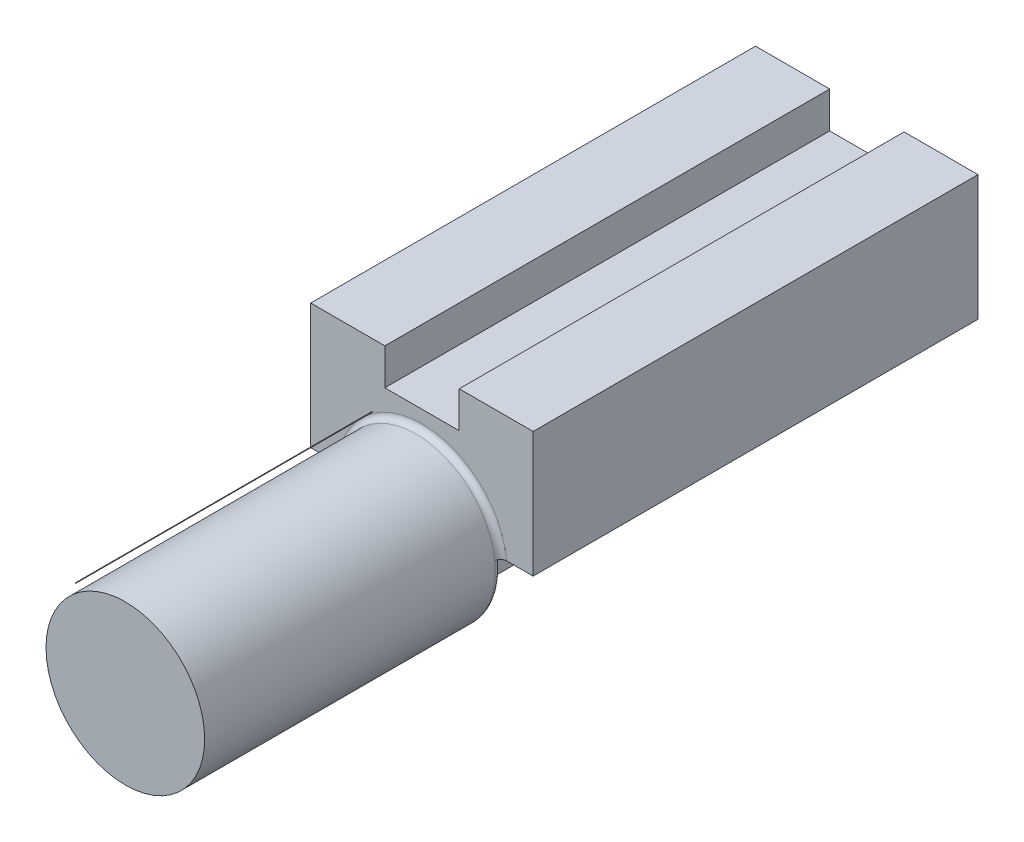
ISO-10303-21;
HEADER;
FILE_DESCRIPTION(('STEP AP214'),'2;1');
FILE_NAME('part.step','',(''),(''),'','','');
FILE_SCHEMA(('AUTOMOTIVE_DESIGN { 1 0 10303 214 1 1 1 1 }'));
ENDSEC;
DATA;
#1=APPLICATION_CONTEXT('core data for automotive mechanical design processes');
#2=APPLICATION_PROTOCOL_DEFINITION('international standard','automotive_design',2000,#1);
#3=PRODUCT_CONTEXT('',#1,'mechanical');
#4=PRODUCT('Part','Part','',(#3));
#5=PRODUCT_RELATED_PRODUCT_CATEGORY('part','',(#4));
#6=PRODUCT_DEFINITION_FORMATION('','',#4);
#7=PRODUCT_DEFINITION_CONTEXT('part definition',#1,'design');
#8=PRODUCT_DEFINITION('design','',#6,#7);
#9=PRODUCT_DEFINITION_SHAPE('','',#8);
#10=(LENGTH_UNIT() NAMED_UNIT(*) SI_UNIT(.MILLI.,.METRE.));
#11=(NAMED_UNIT(*) PLANE_ANGLE_UNIT() SI_UNIT($,.RADIAN.));
#12=(NAMED_UNIT(*) SI_UNIT($,.STERADIAN.) SOLID_ANGLE_UNIT());
#13=UNCERTAINTY_MEASURE_WITH_UNIT(LENGTH_MEASURE(1.E-05),#10,'distance_accuracy_value','');
#14=(GEOMETRIC_REPRESENTATION_CONTEXT(3) GLOBAL_UNCERTAINTY_ASSIGNED_CONTEXT((#13)) GLOBAL_UNIT_ASSIGNED_CONTEXT((#10,
#11,#12)) REPRESENTATION_CONTEXT('',''));
#15=CARTESIAN_POINT('',(0.,0.,0.));
#16=DIRECTION('',(0.,0.,1.));
#17=DIRECTION('',(1.,0.,0.));
#18=AXIS2_PLACEMENT_3D('',#15,#16,#17);
#19=CARTESIAN_POINT('',(-47.3964000000001,-5.63879999999999,76.2));
#20=DIRECTION('',(0.,1.,0.));
#21=DIRECTION('',(0.,0.,1.));
#22=AXIS2_PLACEMENT_3D('',#19,#20,#21);
#23=PLANE('',#22);
#24=DIRECTION('',(0.,0.,1.));
#25=VECTOR('',#24,1.);
#26=CARTESIAN_POINT('',(-15.6464000000001,-5.63879999999999,38.1));
#27=LINE('',#26,#25);
#28=CARTESIAN_POINT('',(-15.6464000000001,-5.63879999999999,38.1));
#29=VERTEX_POINT('',#28);
#30=CARTESIAN_POINT('',(-15.6464000000001,-5.63879999999999,76.2236882308211));
#31=VERTEX_POINT('',#30);
#32=EDGE_CURVE('E4018',#29,#31,#27,.T.);
#33=ORIENTED_EDGE('',*,*,#32,.F.);
#34=DIRECTION('',(-1.,0.,0.));
#35=VECTOR('',#34,1.);
#36=CARTESIAN_POINT('',(-41.0464000000001,-5.63879999999999,38.1));
#37=LINE('',#36,#35);
#38=CARTESIAN_POINT('',(-41.0464000000001,-5.63879999999999,38.1));
#39=VERTEX_POINT('',#38);
#40=EDGE_CURVE('E3990',#29,#39,#37,.T.);
#41=ORIENTED_EDGE('',*,*,#40,.T.);
#42=DIRECTION('',(0.,0.,1.));
#43=VECTOR('',#42,1.);
#44=CARTESIAN_POINT('',(-41.0464000000001,-5.63879999999999,38.1));
#45=LINE('',#44,#43);
#46=CARTESIAN_POINT('',(-41.0464000000001,-5.63879999999999,76.2236882308211));
#47=VERTEX_POINT('',#46);
#48=EDGE_CURVE('E4003',#39,#47,#45,.T.);
#49=ORIENTED_EDGE('',*,*,#48,.T.);
#50=CARTESIAN_POINT('',(-41.0464000000001,-5.63879999999999,76.2236882308211));
#51=CARTESIAN_POINT('',(-41.0745673618872,-5.63879999999999,76.2298356875055));
#52=CARTESIAN_POINT('',(-41.1024631568323,-5.63879999999999,76.2371637991376));
#53=CARTESIAN_POINT('',(-41.1575409224726,-5.63879999999999,76.2541346686096));
#54=CARTESIAN_POINT('',(-41.1847229059231,-5.63879999999999,76.2637773850578));
#55=CARTESIAN_POINT('',(-41.2648883701838,-5.63879999999999,76.2960855787988));
#56=CARTESIAN_POINT('',(-41.3165502569435,-5.63879999999999,76.3221439975724));
#57=CARTESIAN_POINT('',(-41.4147603234984,-5.63879999999999,76.3825795643533));
#58=CARTESIAN_POINT('',(-41.4613056567482,-5.63879999999999,76.416961309245));
#59=CARTESIAN_POINT('',(-41.5479144792402,-5.63879999999999,76.4930719555936));
#60=CARTESIAN_POINT('',(-41.5879811123641,-5.63879999999999,76.534797272823));
#61=CARTESIAN_POINT('',(-41.6603071549674,-5.63879999999999,76.6242219813312));
#62=CARTESIAN_POINT('',(-41.6926016566485,-5.63879999999999,76.6718929860687));
#63=CARTESIAN_POINT('',(-41.7486835857908,-5.63879999999999,76.7720179124678));
#64=CARTESIAN_POINT('',(-41.7724679112481,-5.63879999999999,76.824473569435));
#65=CARTESIAN_POINT('',(-41.8107834457671,-5.63879999999999,76.9326180229628));
#66=CARTESIAN_POINT('',(-41.8253264104508,-5.63879999999999,76.9883026132558));
#67=CARTESIAN_POINT('',(-41.8399110922225,-5.63879999999999,77.0730314747033));
#68=CARTESIAN_POINT('',(-41.8435677151144,-5.63879999999999,77.101496611216));
#69=CARTESIAN_POINT('',(-41.8484480151739,-5.63879999999999,77.1586364860304));
#70=CARTESIAN_POINT('',(-41.8496715420849,-5.63879999999999,77.1873112371672));
#71=CARTESIAN_POINT('',(-41.8496716406063,-5.63879999999999,77.216));
#72=B_SPLINE_CURVE_WITH_KNOTS('',3,(#50,#51,#52,#53,#54,#55,#56,#57,#58,#59,#60,#61,#62,#63,#64,
#65,#66,#67,#68,#69,#70,#71),.UNSPECIFIED.,.F.,.F.,(4,2,2,2,2,2,2,2,2,2,4),(0.,
0.0864385978041805,0.172875649960301,0.345571181396731,0.51836230920786,0.691069334376681,
0.862981285382449,1.03495583551407,1.20671118239226,1.2927182741941,1.37873067723016),.UNSPECIFIED.);
#73=CARTESIAN_POINT('',(-41.8496716406063,-5.63879999999999,77.216));
#74=VERTEX_POINT('',#73);
#75=EDGE_CURVE('E4169',#47,#74,#72,.T.);
#76=ORIENTED_EDGE('',*,*,#75,.T.);
#77=CARTESIAN_POINT('',(-41.8496716406063,-5.63879999999999,77.216));
#78=CARTESIAN_POINT('',(-41.8496717272595,-5.63879999999999,77.1875432249238));
#79=CARTESIAN_POINT('',(-41.8508755472698,-5.63879999999999,77.1591001317297));
#80=CARTESIAN_POINT('',(-41.8556773797049,-5.63879999999999,77.1024185494894));
#81=CARTESIAN_POINT('',(-41.8592752451009,-5.63879999999999,77.0741800479859));
#82=CARTESIAN_POINT('',(-41.8736226655196,-5.63879999999999,76.9901348543328));
#83=CARTESIAN_POINT('',(-41.8879261578878,-5.63879999999999,76.9348928500431));
#84=CARTESIAN_POINT('',(-41.9255979647431,-5.63879999999999,76.8275985463471));
#85=CARTESIAN_POINT('',(-41.9489700343889,-5.63879999999999,76.7755475786531));
#86=CARTESIAN_POINT('',(-42.0040946591598,-5.63879999999999,76.6760920453542));
#87=CARTESIAN_POINT('',(-42.0358461903603,-5.63879999999999,76.6286869130233));
#88=CARTESIAN_POINT('',(-42.1069161567733,-5.63879999999999,76.5397144218545));
#89=CARTESIAN_POINT('',(-42.1462562065649,-5.63879999999999,76.4981643395665));
#90=CARTESIAN_POINT('',(-42.2313259529208,-5.63879999999999,76.4222028577843));
#91=CARTESIAN_POINT('',(-42.2770569830643,-5.63879999999999,76.3877929519341));
#92=CARTESIAN_POINT('',(-42.3738954269246,-5.63879999999999,76.3268801707643));
#93=CARTESIAN_POINT('',(-42.4250337470711,-5.63879999999999,76.3004264842558));
#94=CARTESIAN_POINT('',(-42.5310015256305,-5.63879999999999,76.2564435308777));
#95=CARTESIAN_POINT('',(-42.5858290821921,-5.63879999999999,76.2389097050081));
#96=CARTESIAN_POINT('',(-42.6794103650222,-5.63879999999999,76.2174090948916));
#97=CARTESIAN_POINT('',(-42.7175966049423,-5.63879999999999,76.2108849969276));
#98=CARTESIAN_POINT('',(-42.7944065396167,-5.63879999999999,76.2021808252532));
#99=CARTESIAN_POINT('',(-42.833029544704,-5.63879999999999,76.1999946637489));
#100=CARTESIAN_POINT('',(-42.8716693262466,-5.63879999999999,76.2));
#101=B_SPLINE_CURVE_WITH_KNOTS('',3,(#77,#78,#79,#80,#81,#82,#83,#84,#85,#86,#87,#88,#89,#90,
#91,#92,#93,#94,#95,#96,#97,#98,#99,#100),.UNSPECIFIED.,.F.,.F.,(4,2,2,2,2,2,2,2,2,2,2,4),(0.,
0.0853177217724107,0.170630204297843,0.340942346005494,0.511325086749412,0.681687017279454,
0.852541557256624,1.02343180211681,1.19535781740002,1.36719587164696,1.48318374305112,
1.599008723395),.UNSPECIFIED.);
#102=CARTESIAN_POINT('',(-42.8716693262466,-5.63879999999999,76.2));
#103=VERTEX_POINT('',#102);
#104=EDGE_CURVE('E3878',#74,#103,#101,.T.);
#105=ORIENTED_EDGE('',*,*,#104,.T.);
#106=DIRECTION('',(1.,0.,0.));
#107=VECTOR('',#106,1.);
#108=CARTESIAN_POINT('',(-47.3964000000001,-5.63879999999999,76.2));
#109=LINE('',#108,#107);
#110=CARTESIAN_POINT('',(-47.3964000000001,-5.63879999999999,76.2));
#111=VERTEX_POINT('',#110);
#112=EDGE_CURVE('E4037',#111,#103,#109,.T.);
#113=ORIENTED_EDGE('',*,*,#112,.F.);
#114=DIRECTION('',(0.,0.,-1.));
#115=VECTOR('',#114,1.);
#116=CARTESIAN_POINT('',(-47.3964000000001,-5.63879999999999,76.2));
#117=LINE('',#116,#115);
#118=CARTESIAN_POINT('',(-47.3964000000001,-5.63879999999999,0.));
#119=VERTEX_POINT('',#118);
#120=EDGE_CURVE('E4035',#111,#119,#117,.T.);
#121=ORIENTED_EDGE('',*,*,#120,.T.);
#122=DIRECTION('',(1.,0.,0.));
#123=VECTOR('',#122,1.);
#124=CARTESIAN_POINT('',(-47.3964000000001,-5.63879999999999,0.));
#125=LINE('',#124,#123);
#126=CARTESIAN_POINT('',(-9.29640000000005,-5.63879999999999,0.));
#127=VERTEX_POINT('',#126);
#128=EDGE_CURVE('E4030',#119,#127,#125,.T.);
#129=ORIENTED_EDGE('',*,*,#128,.T.);
#130=DIRECTION('',(0.,0.,-1.));
#131=VECTOR('',#130,1.);
#132=CARTESIAN_POINT('',(-9.29640000000005,-5.63879999999999,76.2));
#133=LINE('',#132,#131);
#134=CARTESIAN_POINT('',(-9.29640000000005,-5.63879999999999,76.2));
#135=VERTEX_POINT('',#134);
#136=EDGE_CURVE('E4109',#135,#127,#133,.T.);
#137=ORIENTED_EDGE('',*,*,#136,.F.);
#138=CARTESIAN_POINT('',(-13.8211306737535,-5.63879999999999,76.2));
#139=VERTEX_POINT('',#138);
#140=EDGE_CURVE('E4036',#139,#135,#109,.T.);
#141=ORIENTED_EDGE('',*,*,#140,.F.);
#142=CARTESIAN_POINT('',(-13.8211306737535,-5.63879999999999,76.2));
#143=CARTESIAN_POINT('',(-13.8500026760034,-5.63879999999999,76.2000002739252));
#144=CARTESIAN_POINT('',(-13.8788608477045,-5.63879999999999,76.20121805118));
#145=CARTESIAN_POINT('',(-13.936371317331,-5.63879999999999,76.2060763412908));
#146=CARTESIAN_POINT('',(-13.9650236235252,-5.63879999999999,76.2097167562842));
#147=CARTESIAN_POINT('',(-14.0503222330379,-5.63879999999999,76.2242391068142));
#148=CARTESIAN_POINT('',(-14.1063982458794,-5.63879999999999,76.2387222332714));
#149=CARTESIAN_POINT('',(-14.2153231222594,-5.63879999999999,76.2768999441325));
#150=CARTESIAN_POINT('',(-14.2681702988293,-5.63879999999999,76.30059929691));
#151=CARTESIAN_POINT('',(-14.3691214099318,-5.63879999999999,76.3565494148125));
#152=CARTESIAN_POINT('',(-14.4172263505665,-5.63879999999999,76.3887983606958));
#153=CARTESIAN_POINT('',(-14.5072081289998,-5.63879999999999,76.4608700138062));
#154=CARTESIAN_POINT('',(-14.5490982507614,-5.63879999999999,76.5006761398794));
#155=CARTESIAN_POINT('',(-14.625565650567,-5.63879999999999,76.5868006668113));
#156=CARTESIAN_POINT('',(-14.6601415950229,-5.63879999999999,76.6331202527053));
#157=CARTESIAN_POINT('',(-14.720787707501,-5.63879999999999,76.7306831123724));
#158=CARTESIAN_POINT('',(-14.7469017511652,-5.63879999999999,76.7818991449183));
#159=CARTESIAN_POINT('',(-14.7900896967655,-5.63879999999999,76.8879941889962));
#160=CARTESIAN_POINT('',(-14.8071696967977,-5.63879999999999,76.9428707014085));
#161=CARTESIAN_POINT('',(-14.8273412335828,-5.63879999999999,77.0344299801769));
#162=CARTESIAN_POINT('',(-14.8332578064347,-5.63879999999999,77.0705149932606));
#163=CARTESIAN_POINT('',(-14.8411507001682,-5.63879999999999,77.1430613805037));
#164=CARTESIAN_POINT('',(-14.8431326073051,-5.63879999999999,77.179522147099));
#165=CARTESIAN_POINT('',(-14.8431283593938,-5.63879999999999,77.216));
#166=B_SPLINE_CURVE_WITH_KNOTS('',3,(#142,#143,#144,#145,#146,#147,#148,#149,#150,#151,#152,
#153,#154,#155,#156,#157,#158,#159,#160,#161,#162,#163,#164,#165),.UNSPECIFIED.,.F.,.F.,(4,2,2,
2,2,2,2,2,2,2,2,4),(0.,0.0865628602947868,0.173122224091188,0.345980249859958,0.518927829702763,
0.691838638054347,0.864374359185328,1.03694151155104,1.2085990130016,1.38014049506961,
1.48964254135696,1.59898901024009),.UNSPECIFIED.);
#167=CARTESIAN_POINT('',(-14.8431283593938,-5.63879999999999,77.216));
#168=VERTEX_POINT('',#167);
#169=EDGE_CURVE('E12',#139,#168,#166,.T.);
#170=ORIENTED_EDGE('',*,*,#169,.T.);
#171=CARTESIAN_POINT('',(-14.8431283593938,-5.63879999999999,77.216));
#172=CARTESIAN_POINT('',(-14.8431284577655,-5.63879999999999,77.1875543129654));
#173=CARTESIAN_POINT('',(-14.8443313252458,-5.63879999999999,77.1591222981162));
#174=CARTESIAN_POINT('',(-14.8491294566338,-5.63879999999999,77.1024625695316));
#175=CARTESIAN_POINT('',(-14.8527245797872,-5.63879999999999,77.0742348438751));
#176=CARTESIAN_POINT('',(-14.867064949022,-5.63879999999999,76.990199848307));
#177=CARTESIAN_POINT('',(-14.8813652810455,-5.63879999999999,76.9349571909388));
#178=CARTESIAN_POINT('',(-14.9190325721611,-5.63879999999999,76.8276645698708));
#179=CARTESIAN_POINT('',(-14.9424028436916,-5.63879999999999,76.7756157806578));
#180=CARTESIAN_POINT('',(-14.9975189318313,-5.63879999999999,76.6761796075959));
#181=CARTESIAN_POINT('',(-15.0292615445978,-5.63879999999999,76.628790450149));
#182=CARTESIAN_POINT('',(-15.1003052933881,-5.63879999999999,76.5398618622193));
#183=CARTESIAN_POINT('',(-15.1396258772937,-5.63879999999999,76.4983379698713));
#184=CARTESIAN_POINT('',(-15.2246534922953,-5.63879999999999,76.4224136453241));
#185=CARTESIAN_POINT('',(-15.2703639418745,-5.63879999999999,76.3880170507361));
#186=CARTESIAN_POINT('',(-15.3688336675393,-5.63879999999999,76.3260838423083));
#187=CARTESIAN_POINT('',(-15.4218015161962,-5.63879999999999,76.2988759723372));
#188=CARTESIAN_POINT('',(-15.5041242963091,-5.63879999999999,76.2652259170642));
#189=CARTESIAN_POINT('',(-15.5320650349612,-5.63879999999999,76.2551981883306));
#190=CARTESIAN_POINT('',(-15.5887077256962,-5.63879999999999,76.237592985236));
#191=CARTESIAN_POINT('',(-15.6174096666362,-5.63879999999999,76.230015475029));
#192=CARTESIAN_POINT('',(-15.6464000000001,-5.63879999999999,76.2236882308211));
#193=B_SPLINE_CURVE_WITH_KNOTS('',3,(#171,#172,#173,#174,#175,#176,#177,#178,#179,#180,#181,
#182,#183,#184,#185,#186,#187,#188,#189,#190,#191,#192),.UNSPECIFIED.,.F.,.F.,(4,2,2,2,2,2,2,2,
2,2,4),(0.,0.0852845032502788,0.170563989015607,0.340875453642173,0.511249176446996,
0.681557796711227,0.852309456681309,1.02315281836225,1.20081764850231,1.28977921206654,
1.37873947408984),.UNSPECIFIED.);
#194=EDGE_CURVE('E4122',#168,#31,#193,.T.);
#195=ORIENTED_EDGE('',*,*,#194,.T.);
#196=EDGE_LOOP('',(#33,#41,#49,#76,#105,#113,#121,#129,#137,#141,#170,#195));
#197=FACE_BOUND('',#196,.T.);
#198=ADVANCED_FACE('F3864',(#197),#23,.F.);
#199=CARTESIAN_POINT('',(-9.29640000000005,9.6012,76.2));
#200=DIRECTION('',(-1.,0.,0.));
#201=DIRECTION('',(0.,0.,1.));
#202=AXIS2_PLACEMENT_3D('',#199,#200,#201);
#203=PLANE('',#202);
#204=DIRECTION('',(0.,1.,0.));
#205=VECTOR('',#204,1.);
#206=CARTESIAN_POINT('',(-9.29640000000005,9.6012,0.));
#207=LINE('',#206,#205);
#208=CARTESIAN_POINT('',(-9.29640000000005,15.8242,0.));
#209=VERTEX_POINT('',#208);
#210=EDGE_CURVE('E4068',#127,#209,#207,.T.);
#211=ORIENTED_EDGE('',*,*,#210,.T.);
#212=DIRECTION('',(0.,0.,-1.));
#213=VECTOR('',#212,1.);
#214=CARTESIAN_POINT('',(-9.29640000000005,15.8242,76.2));
#215=LINE('',#214,#213);
#216=CARTESIAN_POINT('',(-9.29640000000005,15.8242,76.2));
#217=VERTEX_POINT('',#216);
#218=EDGE_CURVE('E4102',#217,#209,#215,.T.);
#219=ORIENTED_EDGE('',*,*,#218,.F.);
#220=DIRECTION('',(0.,1.,0.));
#221=VECTOR('',#220,1.);
#222=CARTESIAN_POINT('',(-9.29640000000005,-5.63879999999999,76.2));
#223=LINE('',#222,#221);
#224=EDGE_CURVE('E4041',#135,#217,#223,.T.);
#225=ORIENTED_EDGE('',*,*,#224,.F.);
#226=ORIENTED_EDGE('',*,*,#136,.T.);
#227=EDGE_LOOP('',(#211,#219,#225,#226));
#228=FACE_BOUND('',#227,.T.);
#229=ADVANCED_FACE('F4220',(#228),#203,.F.);
#230=CARTESIAN_POINT('',(-9.29640000000005,15.8242,76.2));
#231=DIRECTION('',(0.,-1.,0.));
#232=DIRECTION('',(0.,0.,-1.));
#233=AXIS2_PLACEMENT_3D('',#230,#231,#232);
#234=PLANE('',#233);
#235=DIRECTION('',(-1.,0.,0.));
#236=VECTOR('',#235,1.);
#237=CARTESIAN_POINT('',(-9.29640000000005,15.8242,0.));
#238=LINE('',#237,#236);
#239=CARTESIAN_POINT('',(-21.9555733836346,15.8242,0.));
#240=VERTEX_POINT('',#239);
#241=EDGE_CURVE('E4069',#209,#240,#238,.T.);
#242=ORIENTED_EDGE('',*,*,#241,.T.);
#243=DIRECTION('',(0.,0.,-1.));
#244=VECTOR('',#243,1.);
#245=CARTESIAN_POINT('',(-21.9555733836346,15.8242,76.2));
#246=LINE('',#245,#244);
#247=CARTESIAN_POINT('',(-21.9555733836346,15.8242,76.2));
#248=VERTEX_POINT('',#247);
#249=EDGE_CURVE('E4103',#248,#240,#246,.T.);
#250=ORIENTED_EDGE('',*,*,#249,.F.);
#251=DIRECTION('',(-1.,0.,0.));
#252=VECTOR('',#251,1.);
#253=CARTESIAN_POINT('',(-9.29640000000005,15.8242,76.2));
#254=LINE('',#253,#252);
#255=EDGE_CURVE('E4047',#217,#248,#254,.T.);
#256=ORIENTED_EDGE('',*,*,#255,.F.);
#257=ORIENTED_EDGE('',*,*,#218,.T.);
#258=EDGE_LOOP('',(#242,#250,#256,#257));
#259=FACE_BOUND('',#258,.T.);
#260=ADVANCED_FACE('F4213',(#259),#234,.F.);
#261=CARTESIAN_POINT('',(-21.9555733836346,9.6012,76.2));
#262=DIRECTION('',(1.,0.,0.));
#263=DIRECTION('',(0.,0.,-1.));
#264=AXIS2_PLACEMENT_3D('',#261,#262,#263);
#265=PLANE('',#264);
#266=DIRECTION('',(0.,-1.,0.));
#267=VECTOR('',#266,1.);
#268=CARTESIAN_POINT('',(-21.9555733836346,9.6012,0.));
#269=LINE('',#268,#267);
#270=CARTESIAN_POINT('',(-21.9555733836346,9.6012,0.));
#271=VERTEX_POINT('',#270);
#272=EDGE_CURVE('E4075',#240,#271,#269,.T.);
#273=ORIENTED_EDGE('',*,*,#272,.T.);
#274=DIRECTION('',(0.,0.,-1.));
#275=VECTOR('',#274,1.);
#276=CARTESIAN_POINT('',(-21.9555733836346,9.6012,76.2));
#277=LINE('',#276,#275);
#278=CARTESIAN_POINT('',(-21.9555733836346,9.6012,76.2));
#279=VERTEX_POINT('',#278);
#280=EDGE_CURVE('E4096',#279,#271,#277,.T.);
#281=ORIENTED_EDGE('',*,*,#280,.F.);
#282=DIRECTION('',(0.,-1.,0.));
#283=VECTOR('',#282,1.);
#284=CARTESIAN_POINT('',(-21.9555733836346,9.6012,76.2));
#285=LINE('',#284,#283);
#286=EDGE_CURVE('E4046',#248,#279,#285,.T.);
#287=ORIENTED_EDGE('',*,*,#286,.F.);
#288=ORIENTED_EDGE('',*,*,#249,.T.);
#289=EDGE_LOOP('',(#273,#281,#287,#288));
#290=FACE_BOUND('',#289,.T.);
#291=ADVANCED_FACE('F4209',(#290),#265,.F.);
#292=CARTESIAN_POINT('',(-34.6964000000001,9.6012,76.2));
#293=DIRECTION('',(0.,-1.,0.));
#294=DIRECTION('',(0.,0.,-1.));
#295=AXIS2_PLACEMENT_3D('',#292,#293,#294);
#296=PLANE('',#295);
#297=DIRECTION('',(-1.,0.,0.));
#298=VECTOR('',#297,1.);
#299=CARTESIAN_POINT('',(-34.6964000000001,9.6012,0.));
#300=LINE('',#299,#298);
#301=CARTESIAN_POINT('',(-34.6964000000001,9.6012,0.));
#302=VERTEX_POINT('',#301);
#303=EDGE_CURVE('E4074',#271,#302,#300,.T.);
#304=ORIENTED_EDGE('',*,*,#303,.T.);
#305=DIRECTION('',(0.,0.,-1.));
#306=VECTOR('',#305,1.);
#307=CARTESIAN_POINT('',(-34.6964000000001,9.6012,76.2));
#308=LINE('',#307,#306);
#309=CARTESIAN_POINT('',(-34.6964000000001,9.6012,76.2));
#310=VERTEX_POINT('',#309);
#311=EDGE_CURVE('E4094',#310,#302,#308,.T.);
#312=ORIENTED_EDGE('',*,*,#311,.F.);
#313=DIRECTION('',(-1.,0.,0.));
#314=VECTOR('',#313,1.);
#315=CARTESIAN_POINT('',(-34.6964000000001,9.6012,76.2));
#316=LINE('',#315,#314);
#317=EDGE_CURVE('E4051',#279,#310,#316,.T.);
#318=ORIENTED_EDGE('',*,*,#317,.F.);
#319=ORIENTED_EDGE('',*,*,#280,.T.);
#320=EDGE_LOOP('',(#304,#312,#318,#319));
#321=FACE_BOUND('',#320,.T.);
#322=ADVANCED_FACE('F4206',(#321),#296,.F.);
#323=CARTESIAN_POINT('',(-34.6964000000001,9.6012,76.2));
#324=DIRECTION('',(-1.,0.,0.));
#325=DIRECTION('',(0.,0.,1.));
#326=AXIS2_PLACEMENT_3D('',#323,#324,#325);
#327=PLANE('',#326);
#328=DIRECTION('',(0.,1.,0.));
#329=VECTOR('',#328,1.);
#330=CARTESIAN_POINT('',(-34.6964000000001,9.6012,0.));
#331=LINE('',#330,#329);
#332=CARTESIAN_POINT('',(-34.6964000000001,15.8242,0.));
#333=VERTEX_POINT('',#332);
#334=EDGE_CURVE('E4078',#302,#333,#331,.T.);
#335=ORIENTED_EDGE('',*,*,#334,.T.);
#336=DIRECTION('',(0.,0.,-1.));
#337=VECTOR('',#336,1.);
#338=CARTESIAN_POINT('',(-34.6964000000001,15.8242,76.2));
#339=LINE('',#338,#337);
#340=CARTESIAN_POINT('',(-34.6964000000001,15.8242,76.2));
#341=VERTEX_POINT('',#340);
#342=EDGE_CURVE('E4086',#341,#333,#339,.T.);
#343=ORIENTED_EDGE('',*,*,#342,.F.);
#344=DIRECTION('',(0.,1.,0.));
#345=VECTOR('',#344,1.);
#346=CARTESIAN_POINT('',(-34.6964000000001,9.6012,76.2));
#347=LINE('',#346,#345);
#348=EDGE_CURVE('E4052',#310,#341,#347,.T.);
#349=ORIENTED_EDGE('',*,*,#348,.F.);
#350=ORIENTED_EDGE('',*,*,#311,.T.);
#351=EDGE_LOOP('',(#335,#343,#349,#350));
#352=FACE_BOUND('',#351,.T.);
#353=ADVANCED_FACE('F4205',(#352),#327,.F.);
#354=CARTESIAN_POINT('',(-47.3964000000001,15.8242,76.2));
#355=DIRECTION('',(0.,-1.,0.));
#356=DIRECTION('',(0.,0.,-1.));
#357=AXIS2_PLACEMENT_3D('',#354,#355,#356);
#358=PLANE('',#357);
#359=DIRECTION('',(-1.,0.,0.));
#360=VECTOR('',#359,1.);
#361=CARTESIAN_POINT('',(-47.3964000000001,15.8242,0.));
#362=LINE('',#361,#360);
#363=CARTESIAN_POINT('',(-47.3964000000001,15.8242,0.));
#364=VERTEX_POINT('',#363);
#365=EDGE_CURVE('E4081',#333,#364,#362,.T.);
#366=ORIENTED_EDGE('',*,*,#365,.T.);
#367=DIRECTION('',(0.,0.,-1.));
#368=VECTOR('',#367,1.);
#369=CARTESIAN_POINT('',(-47.3964000000001,15.8242,76.2));
#370=LINE('',#369,#368);
#371=CARTESIAN_POINT('',(-47.3964000000001,15.8242,76.2));
#372=VERTEX_POINT('',#371);
#373=EDGE_CURVE('E4062',#372,#364,#370,.T.);
#374=ORIENTED_EDGE('',*,*,#373,.F.);
#375=DIRECTION('',(-1.,0.,0.));
#376=VECTOR('',#375,1.);
#377=CARTESIAN_POINT('',(-47.3964000000001,15.8242,76.2));
#378=LINE('',#377,#376);
#379=EDGE_CURVE('E4059',#341,#372,#378,.T.);
#380=ORIENTED_EDGE('',*,*,#379,.F.);
#381=ORIENTED_EDGE('',*,*,#342,.T.);
#382=EDGE_LOOP('',(#366,#374,#380,#381));
#383=FACE_BOUND('',#382,.T.);
#384=ADVANCED_FACE('F4196',(#383),#358,.F.);
#385=CARTESIAN_POINT('',(-47.3964000000001,9.6012,76.2));
#386=DIRECTION('',(1.,0.,0.));
#387=DIRECTION('',(0.,0.,-1.));
#388=AXIS2_PLACEMENT_3D('',#385,#386,#387);
#389=PLANE('',#388);
#390=DIRECTION('',(0.,-1.,0.));
#391=VECTOR('',#390,1.);
#392=CARTESIAN_POINT('',(-47.3964000000001,9.6012,0.));
#393=LINE('',#392,#391);
#394=EDGE_CURVE('E4039',#364,#119,#393,.T.);
#395=ORIENTED_EDGE('',*,*,#394,.T.);
#396=ORIENTED_EDGE('',*,*,#120,.F.);
#397=DIRECTION('',(0.,-1.,0.));
#398=VECTOR('',#397,1.);
#399=CARTESIAN_POINT('',(-47.3964000000001,-5.63879999999999,76.2));
#400=LINE('',#399,#398);
#401=EDGE_CURVE('E4033',#372,#111,#400,.T.);
#402=ORIENTED_EDGE('',*,*,#401,.F.);
#403=ORIENTED_EDGE('',*,*,#373,.T.);
#404=EDGE_LOOP('',(#395,#396,#402,#403));
#405=FACE_BOUND('',#404,.T.);
#406=ADVANCED_FACE('F4192',(#405),#389,.F.);
#407=CARTESIAN_POINT('',(0.,0.,76.2));
#408=DIRECTION('',(0.,0.,-1.));
#409=DIRECTION('',(-1.,0.,0.));
#410=AXIS2_PLACEMENT_3D('',#407,#408,#409);
#411=PLANE('',#410);
#412=ORIENTED_EDGE('',*,*,#112,.T.);
#413=CARTESIAN_POINT('',(-28.3464000000001,-7.16279999999999,76.2));
#414=DIRECTION('',(0.,0.,-1.));
#415=DIRECTION('',(-1.,0.,0.));
#416=AXIS2_PLACEMENT_3D('',#413,#414,#415);
#417=CIRCLE('',#416,14.605);
#418=EDGE_CURVE('E3892',#103,#139,#417,.T.);
#419=ORIENTED_EDGE('',*,*,#418,.T.);
#420=ORIENTED_EDGE('',*,*,#140,.T.);
#421=ORIENTED_EDGE('',*,*,#224,.T.);
#422=ORIENTED_EDGE('',*,*,#255,.T.);
#423=ORIENTED_EDGE('',*,*,#286,.T.);
#424=ORIENTED_EDGE('',*,*,#317,.T.);
#425=ORIENTED_EDGE('',*,*,#348,.T.);
#426=ORIENTED_EDGE('',*,*,#379,.T.);
#427=ORIENTED_EDGE('',*,*,#401,.T.);
#428=EDGE_LOOP('',(#412,#419,#420,#421,#422,#423,#424,#425,#426,#427));
#429=FACE_BOUND('',#428,.T.);
#430=CARTESIAN_POINT('',(-36.8665223117911,4.94743808499133,76.2));
#431=DIRECTION('',(0.,0.,1.));
#432=DIRECTION('',(1.,0.,0.));
#433=AXIS2_PLACEMENT_3D('',#430,#431,#432);
#434=CIRCLE('',#433,0.0431256224242811);
#435=CARTESIAN_POINT('',(-36.8233966893668,4.94743808499133,76.2));
#436=VERTEX_POINT('',#435);
#437=EDGE_CURVE('E4029',#436,#436,#434,.T.);
#438=ORIENTED_EDGE('',*,*,#437,.F.);
#439=EDGE_LOOP('',(#438));
#440=FACE_BOUND('',#439,.T.);
#441=ADVANCED_FACE('F4188',(#429,#440),#411,.F.);
#442=CARTESIAN_POINT('',(0.,0.,0.));
#443=DIRECTION('',(0.,0.,-1.));
#444=DIRECTION('',(-1.,0.,0.));
#445=AXIS2_PLACEMENT_3D('',#442,#443,#444);
#446=PLANE('',#445);
#447=ORIENTED_EDGE('',*,*,#128,.F.);
#448=ORIENTED_EDGE('',*,*,#394,.F.);
#449=ORIENTED_EDGE('',*,*,#365,.F.);
#450=ORIENTED_EDGE('',*,*,#334,.F.);
#451=ORIENTED_EDGE('',*,*,#303,.F.);
#452=ORIENTED_EDGE('',*,*,#272,.F.);
#453=ORIENTED_EDGE('',*,*,#241,.F.);
#454=ORIENTED_EDGE('',*,*,#210,.F.);
#455=EDGE_LOOP('',(#447,#448,#449,#450,#451,#452,#453,#454));
#456=FACE_BOUND('',#455,.T.);
#457=ADVANCED_FACE('F4187',(#456),#446,.T.);
#458=CARTESIAN_POINT('',(-36.8665223117911,4.94743808499133,127.));
#459=DIRECTION('',(0.,0.,-1.));
#460=DIRECTION('',(-1.,0.,0.));
#461=AXIS2_PLACEMENT_3D('',#458,#459,#460);
#462=CYLINDRICAL_SURFACE('',#461,0.0431256224242811);
#463=CARTESIAN_POINT('',(-36.8665223117911,4.94743808499133,127.));
#464=DIRECTION('',(0.,0.,1.));
#465=DIRECTION('',(1.,0.,0.));
#466=AXIS2_PLACEMENT_3D('',#463,#464,#465);
#467=CIRCLE('',#466,0.0431256224242811);
#468=CARTESIAN_POINT('',(-36.8233966893668,4.94743808499133,127.));
#469=VERTEX_POINT('',#468);
#470=EDGE_CURVE('E4017',#469,#469,#467,.T.);
#471=ORIENTED_EDGE('',*,*,#470,.F.);
#472=EDGE_LOOP('',(#471));
#473=FACE_BOUND('',#472,.T.);
#474=ORIENTED_EDGE('',*,*,#437,.T.);
#475=EDGE_LOOP('',(#474));
#476=FACE_BOUND('',#475,.T.);
#477=ADVANCED_FACE('F4185',(#473,#476),#462,.T.);
#478=CARTESIAN_POINT('',(-36.8665223117911,4.94743808499133,127.));
#479=DIRECTION('',(0.,0.,1.));
#480=DIRECTION('',(1.,0.,0.));
#481=AXIS2_PLACEMENT_3D('',#478,#479,#480);
#482=PLANE('',#481);
#483=ORIENTED_EDGE('',*,*,#470,.T.);
#484=EDGE_LOOP('',(#483));
#485=FACE_BOUND('',#484,.T.);
#486=ADVANCED_FACE('F4176',(#485),#482,.T.);
#487=CARTESIAN_POINT('',(-41.0464000000001,-5.63879999999999,38.1));
#488=DIRECTION('',(-1.,0.,0.));
#489=DIRECTION('',(0.,0.,1.));
#490=AXIS2_PLACEMENT_3D('',#487,#488,#489);
#491=PLANE('',#490);
#492=DIRECTION('',(0.,0.,1.));
#493=VECTOR('',#492,1.);
#494=CARTESIAN_POINT('',(-41.0464000000001,-8.68679999999999,38.1));
#495=LINE('',#494,#493);
#496=CARTESIAN_POINT('',(-41.0464000000001,-8.68679999999999,38.1));
#497=VERTEX_POINT('',#496);
#498=CARTESIAN_POINT('',(-41.0464000000001,-8.68679999999999,76.2236882308211));
#499=VERTEX_POINT('',#498);
#500=EDGE_CURVE('E3972',#497,#499,#495,.T.);
#501=ORIENTED_EDGE('',*,*,#500,.T.);
#502=CARTESIAN_POINT('',(-41.0464000000001,-8.68679999999999,76.2236882308211));
#503=CARTESIAN_POINT('',(-41.0464000000001,-8.60214312169169,76.2214750821351));
#504=CARTESIAN_POINT('',(-41.0464000000001,-8.51747848109991,76.2195967546562));
#505=CARTESIAN_POINT('',(-41.0464000000001,-8.34814006291536,76.2163816451963));
#506=CARTESIAN_POINT('',(-41.0464000000001,-8.26346628548023,76.2150448550215));
#507=CARTESIAN_POINT('',(-41.0464000000001,-8.0094399618843,76.211654608259));
#508=CARTESIAN_POINT('',(-41.0464000000001,-7.84007944860899,76.2102212066536));
#509=CARTESIAN_POINT('',(-41.0464000000001,-7.50134575503464,76.2083784790461));
#510=CARTESIAN_POINT('',(-41.0464000000001,-7.33197257452548,76.20796920421));
#511=CARTESIAN_POINT('',(-41.0464000000001,-6.9932253397274,76.2079682965918));
#512=CARTESIAN_POINT('',(-41.0464000000001,-6.82385128543739,76.2083766662868));
#513=CARTESIAN_POINT('',(-41.0464000000001,-6.5698342597082,76.2097645416175));
#514=CARTESIAN_POINT('',(-41.0464000000001,-6.48518916498489,76.2103561566051));
#515=CARTESIAN_POINT('',(-41.0464000000001,-6.31590291662671,76.2118681580565));
#516=CARTESIAN_POINT('',(-41.0464000000001,-6.23126176295509,76.2127885402791));
#517=CARTESIAN_POINT('',(-41.0464000000001,-6.06197808746643,76.2150460528173));
#518=CARTESIAN_POINT('',(-41.0464000000001,-5.9773355660633,76.2163832158326));
#519=CARTESIAN_POINT('',(-41.0464000000001,-5.80805943795847,76.2195987223141));
#520=CARTESIAN_POINT('',(-41.0464000000001,-5.72342583144099,76.2214770753551));
#521=CARTESIAN_POINT('',(-41.0464000000001,-5.63879999999999,76.2236882308211));
#522=B_SPLINE_CURVE_WITH_KNOTS('',3,(#502,#503,#504,#505,#506,#507,#508,#509,#510,#511,#512,
#513,#514,#515,#516,#517,#518,#519,#520,#521),.UNSPECIFIED.,.F.,.F.,(4,2,2,2,2,2,2,2,2,4),(0.,
0.254055297916384,0.508106751679929,1.01620072983627,1.52432009217853,2.03244099386645,
2.28638201160812,2.54031975365254,2.79427742419107,3.04823958810193),.UNSPECIFIED.);
#523=EDGE_CURVE('E4161',#499,#47,#522,.T.);
#524=ORIENTED_EDGE('',*,*,#523,.T.);
#525=ORIENTED_EDGE('',*,*,#48,.F.);
#526=DIRECTION('',(0.,-1.,0.));
#527=VECTOR('',#526,1.);
#528=CARTESIAN_POINT('',(-41.0464000000001,-5.63879999999999,38.1));
#529=LINE('',#528,#527);
#530=EDGE_CURVE('E3995',#39,#497,#529,.T.);
#531=ORIENTED_EDGE('',*,*,#530,.T.);
#532=EDGE_LOOP('',(#501,#524,#525,#531));
#533=FACE_BOUND('',#532,.T.);
#534=ADVANCED_FACE('F3999',(#533),#491,.T.);
#535=CARTESIAN_POINT('',(-15.6464000000001,-5.63879999999999,38.1));
#536=DIRECTION('',(1.,0.,0.));
#537=DIRECTION('',(0.,0.,-1.));
#538=AXIS2_PLACEMENT_3D('',#535,#536,#537);
#539=PLANE('',#538);
#540=ORIENTED_EDGE('',*,*,#32,.T.);
#541=CARTESIAN_POINT('',(-15.6464000000001,-5.63879999999999,76.2236882308211));
#542=CARTESIAN_POINT('',(-15.6464000000001,-5.7234568783083,76.2214750821351));
#543=CARTESIAN_POINT('',(-15.6464000000001,-5.80812151890008,76.2195967546562));
#544=CARTESIAN_POINT('',(-15.6464000000001,-5.97745993708463,76.2163816451963));
#545=CARTESIAN_POINT('',(-15.6464000000001,-6.06213371451976,76.2150448550215));
#546=CARTESIAN_POINT('',(-15.6464000000001,-6.31616003811569,76.211654608259));
#547=CARTESIAN_POINT('',(-15.6464000000001,-6.485520551391,76.2102212066536));
#548=CARTESIAN_POINT('',(-15.6464000000001,-6.82425424496535,76.2083784790461));
#549=CARTESIAN_POINT('',(-15.6464000000001,-6.99362742547451,76.20796920421));
#550=CARTESIAN_POINT('',(-15.6464000000001,-7.33237466027258,76.2079682965918));
#551=CARTESIAN_POINT('',(-15.6464000000001,-7.5017487145626,76.2083766662868));
#552=CARTESIAN_POINT('',(-15.6464000000001,-7.75576574029179,76.2097645416175));
#553=CARTESIAN_POINT('',(-15.6464000000001,-7.8404108350151,76.2103561566051));
#554=CARTESIAN_POINT('',(-15.6464000000001,-8.00969708337328,76.2118681580565));
#555=CARTESIAN_POINT('',(-15.6464000000001,-8.0943382370449,76.2127885402791));
#556=CARTESIAN_POINT('',(-15.6464000000001,-8.26362191253356,76.2150460528173));
#557=CARTESIAN_POINT('',(-15.6464000000001,-8.34826443393669,76.2163832158326));
#558=CARTESIAN_POINT('',(-15.6464000000001,-8.51754056204152,76.2195987223141));
#559=CARTESIAN_POINT('',(-15.6464000000001,-8.60217416855899,76.2214770753551));
#560=CARTESIAN_POINT('',(-15.6464000000001,-8.68679999999999,76.2236882308211));
#561=B_SPLINE_CURVE_WITH_KNOTS('',3,(#541,#542,#543,#544,#545,#546,#547,#548,#549,#550,#551,
#552,#553,#554,#555,#556,#557,#558,#559,#560),.UNSPECIFIED.,.F.,.F.,(4,2,2,2,2,2,2,2,2,4),(0.,
0.254055297916385,0.508106751679931,1.01620072983627,1.52432009217853,2.03244099386645,
2.28638201160812,2.54031975365254,2.79427742419107,3.04823958810193),.UNSPECIFIED.);
#562=CARTESIAN_POINT('',(-15.6464000000001,-8.68679999999999,76.2236882308211));
#563=VERTEX_POINT('',#562);
#564=EDGE_CURVE('E4129',#31,#563,#561,.T.);
#565=ORIENTED_EDGE('',*,*,#564,.T.);
#566=DIRECTION('',(0.,0.,1.));
#567=VECTOR('',#566,1.);
#568=CARTESIAN_POINT('',(-15.6464000000001,-8.68679999999999,38.1));
#569=LINE('',#568,#567);
#570=CARTESIAN_POINT('',(-15.6464000000001,-8.68679999999999,38.1));
#571=VERTEX_POINT('',#570);
#572=EDGE_CURVE('E3986',#571,#563,#569,.T.);
#573=ORIENTED_EDGE('',*,*,#572,.F.);
#574=DIRECTION('',(0.,1.,0.));
#575=VECTOR('',#574,1.);
#576=CARTESIAN_POINT('',(-15.6464000000001,-5.63879999999999,38.1));
#577=LINE('',#576,#575);
#578=EDGE_CURVE('E3997',#571,#29,#577,.T.);
#579=ORIENTED_EDGE('',*,*,#578,.T.);
#580=EDGE_LOOP('',(#540,#565,#573,#579));
#581=FACE_BOUND('',#580,.T.);
#582=ADVANCED_FACE('F4179',(#581),#539,.T.);
#583=CARTESIAN_POINT('',(-41.0464000000001,-8.68679999999999,38.1));
#584=DIRECTION('',(0.,-1.,0.));
#585=DIRECTION('',(0.,0.,-1.));
#586=AXIS2_PLACEMENT_3D('',#583,#584,#585);
#587=PLANE('',#586);
#588=DIRECTION('',(1.,0.,0.));
#589=VECTOR('',#588,1.);
#590=CARTESIAN_POINT('',(-41.0464000000001,-8.68679999999999,76.2));
#591=LINE('',#590,#589);
#592=CARTESIAN_POINT('',(-40.8266945878694,-8.68679999999999,76.2));
#593=VERTEX_POINT('',#592);
#594=CARTESIAN_POINT('',(-15.8661054121307,-8.68679999999999,76.2));
#595=VERTEX_POINT('',#594);
#596=EDGE_CURVE('E4001',#593,#595,#591,.T.);
#597=ORIENTED_EDGE('',*,*,#596,.F.);
#598=CARTESIAN_POINT('',(-40.8266945878694,-8.68679999999999,76.2));
#599=CARTESIAN_POINT('',(-40.8637366900842,-8.68679999999999,76.2000104191685));
#600=CARTESIAN_POINT('',(-40.9005665190771,-8.68679999999999,76.2019896465806));
#601=CARTESIAN_POINT('',(-40.973801656757,-8.68679999999999,76.2098857207102));
#602=CARTESIAN_POINT('',(-41.0102069651411,-8.68679999999999,76.2158025702385));
#603=CARTESIAN_POINT('',(-41.0464000000001,-8.68679999999999,76.2236882308211));
#604=B_SPLINE_CURVE_WITH_KNOTS('',3,(#598,#599,#600,#601,#602,#603),.UNSPECIFIED.,.F.,.F.,(4,2,
4),(0.,0.110648916863796,0.221297912710533),.UNSPECIFIED.);
#605=EDGE_CURVE('E3982',#593,#499,#604,.T.);
#606=ORIENTED_EDGE('',*,*,#605,.T.);
#607=ORIENTED_EDGE('',*,*,#500,.F.);
#608=DIRECTION('',(1.,0.,0.));
#609=VECTOR('',#608,1.);
#610=CARTESIAN_POINT('',(-41.0464000000001,-8.68679999999999,38.1));
#611=LINE('',#610,#609);
#612=EDGE_CURVE('E3979',#497,#571,#611,.T.);
#613=ORIENTED_EDGE('',*,*,#612,.T.);
#614=ORIENTED_EDGE('',*,*,#572,.T.);
#615=CARTESIAN_POINT('',(-15.6464000000001,-8.68679999999999,76.2236882308211));
#616=CARTESIAN_POINT('',(-15.6825930348591,-8.68679999999999,76.2158025702385));
#617=CARTESIAN_POINT('',(-15.7189983432431,-8.68679999999999,76.2098857207102));
#618=CARTESIAN_POINT('',(-15.792233480923,-8.68679999999999,76.2019896465806));
#619=CARTESIAN_POINT('',(-15.8290633099159,-8.68679999999999,76.2000104191685));
#620=CARTESIAN_POINT('',(-15.8661054121307,-8.68679999999999,76.2));
#621=B_SPLINE_CURVE_WITH_KNOTS('',3,(#615,#616,#617,#618,#619,#620),.UNSPECIFIED.,.F.,.F.,(4,2,
4),(0.,0.110648995846737,0.221297912710529),.UNSPECIFIED.);
#622=EDGE_CURVE('E4149',#563,#595,#621,.T.);
#623=ORIENTED_EDGE('',*,*,#622,.T.);
#624=EDGE_LOOP('',(#597,#606,#607,#613,#614,#623));
#625=FACE_BOUND('',#624,.T.);
#626=ADVANCED_FACE('F3976',(#625),#587,.T.);
#627=CARTESIAN_POINT('',(0.,0.,38.1));
#628=DIRECTION('',(0.,0.,1.));
#629=DIRECTION('',(1.,0.,0.));
#630=AXIS2_PLACEMENT_3D('',#627,#628,#629);
#631=PLANE('',#630);
#632=ORIENTED_EDGE('',*,*,#530,.F.);
#633=ORIENTED_EDGE('',*,*,#40,.F.);
#634=ORIENTED_EDGE('',*,*,#578,.F.);
#635=ORIENTED_EDGE('',*,*,#612,.F.);
#636=EDGE_LOOP('',(#632,#633,#634,#635));
#637=FACE_BOUND('',#636,.T.);
#638=ADVANCED_FACE('F3994',(#637),#631,.F.);
#639=CARTESIAN_POINT('',(-28.3464000000001,-7.16279999999999,76.2));
#640=DIRECTION('',(0.,0.,1.));
#641=DIRECTION('',(1.,0.,0.));
#642=AXIS2_PLACEMENT_3D('',#639,#640,#641);
#643=PLANE('',#642);
#644=ORIENTED_EDGE('',*,*,#596,.T.);
#645=CARTESIAN_POINT('',(-28.3464000000001,-7.16279999999999,76.2));
#646=DIRECTION('',(0.,0.,1.));
#647=DIRECTION('',(1.,0.,0.));
#648=AXIS2_PLACEMENT_3D('',#645,#646,#647);
#649=CIRCLE('',#648,12.573);
#650=EDGE_CURVE('E4118',#595,#593,#649,.F.);
#651=ORIENTED_EDGE('',*,*,#650,.T.);
#652=EDGE_LOOP('',(#644,#651));
#653=FACE_BOUND('',#652,.T.);
#654=ADVANCED_FACE('F4275',(#653),#643,.F.);
#655=CARTESIAN_POINT('',(-28.3464000000001,-7.16279999999999,127.));
#656=DIRECTION('',(0.,0.,-1.));
#657=DIRECTION('',(-1.,0.,0.));
#658=AXIS2_PLACEMENT_3D('',#655,#656,#657);
#659=CYLINDRICAL_SURFACE('',#658,13.589);
#660=CARTESIAN_POINT('',(-28.3464000000001,-7.16279999999999,127.));
#661=DIRECTION('',(0.,0.,1.));
#662=DIRECTION('',(1.,0.,0.));
#663=AXIS2_PLACEMENT_3D('',#660,#661,#662);
#664=CIRCLE('',#663,13.589);
#665=CARTESIAN_POINT('',(-14.7574000000001,-7.16279999999999,127.));
#666=VERTEX_POINT('',#665);
#667=EDGE_CURVE('E4008',#666,#666,#664,.T.);
#668=ORIENTED_EDGE('',*,*,#667,.F.);
#669=EDGE_LOOP('',(#668));
#670=FACE_BOUND('',#669,.T.);
#671=CARTESIAN_POINT('',(-28.3464000000001,-7.16279999999999,77.216));
#672=DIRECTION('',(0.,0.,1.));
#673=DIRECTION('',(1.,0.,0.));
#674=AXIS2_PLACEMENT_3D('',#671,#672,#673);
#675=CIRCLE('',#674,13.589);
#676=EDGE_CURVE('E4031',#74,#168,#675,.T.);
#677=ORIENTED_EDGE('',*,*,#676,.T.);
#678=CARTESIAN_POINT('',(-28.3464000000001,-7.16279999999999,77.216));
#679=DIRECTION('',(0.,0.,-1.));
#680=DIRECTION('',(-1.,0.,0.));
#681=AXIS2_PLACEMENT_3D('',#678,#679,#680);
#682=CIRCLE('',#681,13.589);
#683=EDGE_CURVE('E4254',#168,#74,#682,.F.);
#684=ORIENTED_EDGE('',*,*,#683,.T.);
#685=EDGE_LOOP('',(#677,#684));
#686=FACE_BOUND('',#685,.T.);
#687=ADVANCED_FACE('F4269',(#670,#686),#659,.T.);
#688=CARTESIAN_POINT('',(-28.3464000000001,-7.16279999999999,127.));
#689=DIRECTION('',(0.,0.,1.));
#690=DIRECTION('',(1.,0.,0.));
#691=AXIS2_PLACEMENT_3D('',#688,#689,#690);
#692=PLANE('',#691);
#693=ORIENTED_EDGE('',*,*,#667,.T.);
#694=EDGE_LOOP('',(#693));
#695=FACE_BOUND('',#694,.T.);
#696=ADVANCED_FACE('F4145',(#695),#692,.T.);
#697=CARTESIAN_POINT('',(-28.3464000000001,-7.16279999999999,77.216));
#698=DIRECTION('',(0.,0.,1.));
#699=DIRECTION('',(1.,0.,0.));
#700=AXIS2_PLACEMENT_3D('',#697,#698,#699);
#701=TOROIDAL_SURFACE('',#700,12.573,1.016);
#702=ORIENTED_EDGE('',*,*,#605,.F.);
#703=ORIENTED_EDGE('',*,*,#650,.F.);
#704=ORIENTED_EDGE('',*,*,#622,.F.);
#705=ORIENTED_EDGE('',*,*,#564,.F.);
#706=ORIENTED_EDGE('',*,*,#194,.F.);
#707=ORIENTED_EDGE('',*,*,#676,.F.);
#708=ORIENTED_EDGE('',*,*,#75,.F.);
#709=ORIENTED_EDGE('',*,*,#523,.F.);
#710=EDGE_LOOP('',(#702,#703,#704,#705,#706,#707,#708,#709));
#711=FACE_BOUND('',#710,.T.);
#712=ADVANCED_FACE('F4137',(#711),#701,.T.);
#713=CARTESIAN_POINT('',(-28.3464000000001,-7.16279999999999,77.216));
#714=DIRECTION('',(0.,0.,-1.));
#715=DIRECTION('',(-1.,0.,0.));
#716=AXIS2_PLACEMENT_3D('',#713,#714,#715);
#717=TOROIDAL_SURFACE('',#716,14.605,1.016);
#718=ORIENTED_EDGE('',*,*,#169,.F.);
#719=ORIENTED_EDGE('',*,*,#418,.F.);
#720=ORIENTED_EDGE('',*,*,#104,.F.);
#721=ORIENTED_EDGE('',*,*,#683,.F.);
#722=EDGE_LOOP('',(#718,#719,#720,#721));
#723=FACE_BOUND('',#722,.T.);
#724=ADVANCED_FACE('F3865',(#723),#717,.F.);
#725=CLOSED_SHELL('',(#198,#229,#260,#291,#322,#353,#384,#406,#441,#457,#477,#486,#534,#582,
#626,#638,#654,#687,#696,#712,#724));
#726=MANIFOLD_SOLID_BREP('B2',#725);
#727=ADVANCED_BREP_SHAPE_REPRESENTATION('',(#18,#726),#14);
#728=SHAPE_DEFINITION_REPRESENTATION(#9,#727);
ENDSEC;
END-ISO-10303-21;
